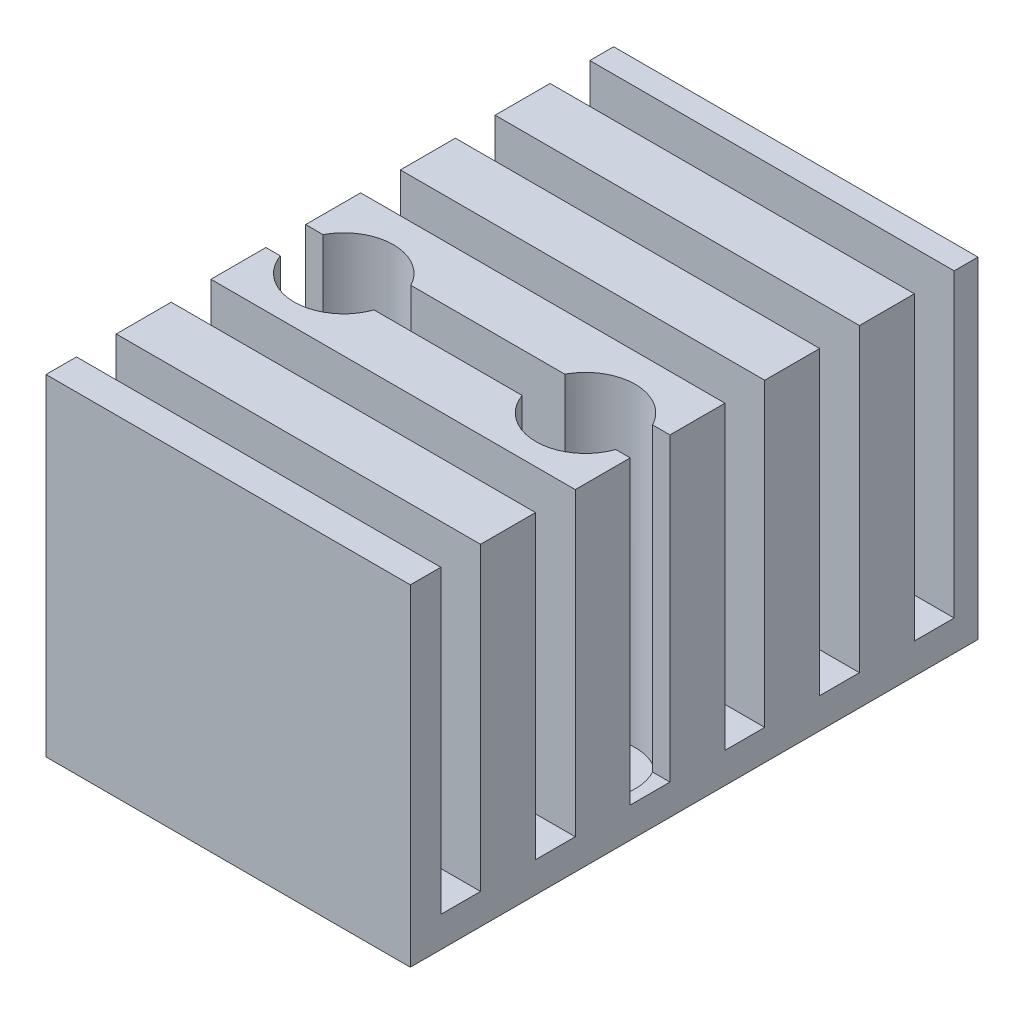
ISO-10303-21;
HEADER;
FILE_DESCRIPTION(('STEP AP214'),'2;1');
FILE_NAME('part.step','',(''),(''),'','','');
FILE_SCHEMA(('AUTOMOTIVE_DESIGN { 1 0 10303 214 1 1 1 1 }'));
ENDSEC;
DATA;
#1=APPLICATION_CONTEXT('core data for automotive mechanical design processes');
#2=APPLICATION_PROTOCOL_DEFINITION('international standard','automotive_design',2000,#1);
#3=PRODUCT_CONTEXT('',#1,'mechanical');
#4=PRODUCT('Part','Part','',(#3));
#5=PRODUCT_RELATED_PRODUCT_CATEGORY('part','',(#4));
#6=PRODUCT_DEFINITION_FORMATION('','',#4);
#7=PRODUCT_DEFINITION_CONTEXT('part definition',#1,'design');
#8=PRODUCT_DEFINITION('design','',#6,#7);
#9=PRODUCT_DEFINITION_SHAPE('','',#8);
#10=(LENGTH_UNIT() NAMED_UNIT(*) SI_UNIT(.MILLI.,.METRE.));
#11=(NAMED_UNIT(*) PLANE_ANGLE_UNIT() SI_UNIT($,.RADIAN.));
#12=(NAMED_UNIT(*) SI_UNIT($,.STERADIAN.) SOLID_ANGLE_UNIT());
#13=UNCERTAINTY_MEASURE_WITH_UNIT(LENGTH_MEASURE(1.E-05),#10,'distance_accuracy_value','');
#14=(GEOMETRIC_REPRESENTATION_CONTEXT(3) GLOBAL_UNCERTAINTY_ASSIGNED_CONTEXT((#13)) GLOBAL_UNIT_ASSIGNED_CONTEXT((#10,
#11,#12)) REPRESENTATION_CONTEXT('',''));
#15=CARTESIAN_POINT('',(0.,0.,0.));
#16=DIRECTION('',(0.,0.,1.));
#17=DIRECTION('',(1.,0.,0.));
#18=AXIS2_PLACEMENT_3D('',#15,#16,#17);
#19=CARTESIAN_POINT('',(3.65,10.,1.43));
#20=DIRECTION('',(0.,-1.,0.));
#21=DIRECTION('',(0.,0.,-1.));
#22=AXIS2_PLACEMENT_3D('',#19,#20,#21);
#23=CYLINDRICAL_SURFACE('',#22,0.799999999999999);
#24=CARTESIAN_POINT('',(3.65,0.,1.43));
#25=DIRECTION('',(0.,1.,0.));
#26=DIRECTION('',(0.,0.,1.));
#27=AXIS2_PLACEMENT_3D('',#24,#25,#26);
#28=CIRCLE('',#27,0.799999999999999);
#29=CARTESIAN_POINT('',(3.65,0.,2.23));
#30=VERTEX_POINT('',#29);
#31=EDGE_CURVE('E613',#30,#30,#28,.T.);
#32=ORIENTED_EDGE('',*,*,#31,.F.);
#33=EDGE_LOOP('',(#32));
#34=FACE_BOUND('',#33,.T.);
#35=CARTESIAN_POINT('',(3.65,0.5,1.43));
#36=DIRECTION('',(0.,1.,0.));
#37=DIRECTION('',(0.,0.,1.));
#38=AXIS2_PLACEMENT_3D('',#35,#36,#37);
#39=CIRCLE('',#38,0.799999999999999);
#40=CARTESIAN_POINT('',(3.65,0.5,2.23));
#41=VERTEX_POINT('',#40);
#42=EDGE_CURVE('E43',#41,#41,#39,.T.);
#43=ORIENTED_EDGE('',*,*,#42,.T.);
#44=EDGE_LOOP('',(#43));
#45=FACE_BOUND('',#44,.T.);
#46=ADVANCED_FACE('F39',(#34,#45),#23,.F.);
#47=CARTESIAN_POINT('',(-3.65,10.,1.43));
#48=DIRECTION('',(0.,-1.,0.));
#49=DIRECTION('',(0.,0.,-1.));
#50=AXIS2_PLACEMENT_3D('',#47,#48,#49);
#51=CYLINDRICAL_SURFACE('',#50,0.8);
#52=CARTESIAN_POINT('',(-3.65,0.,1.43));
#53=DIRECTION('',(0.,1.,0.));
#54=DIRECTION('',(0.,0.,1.));
#55=AXIS2_PLACEMENT_3D('',#52,#53,#54);
#56=CIRCLE('',#55,0.8);
#57=CARTESIAN_POINT('',(-3.65,0.,2.23));
#58=VERTEX_POINT('',#57);
#59=EDGE_CURVE('E553',#58,#58,#56,.T.);
#60=ORIENTED_EDGE('',*,*,#59,.F.);
#61=EDGE_LOOP('',(#60));
#62=FACE_BOUND('',#61,.T.);
#63=CARTESIAN_POINT('',(-3.65,0.5,1.43));
#64=DIRECTION('',(0.,1.,0.));
#65=DIRECTION('',(0.,0.,1.));
#66=AXIS2_PLACEMENT_3D('',#63,#64,#65);
#67=CIRCLE('',#66,0.8);
#68=CARTESIAN_POINT('',(-3.65,0.5,2.23));
#69=VERTEX_POINT('',#68);
#70=EDGE_CURVE('E480',#69,#69,#67,.T.);
#71=ORIENTED_EDGE('',*,*,#70,.T.);
#72=EDGE_LOOP('',(#71));
#73=FACE_BOUND('',#72,.T.);
#74=ADVANCED_FACE('F738',(#62,#73),#51,.F.);
#75=CARTESIAN_POINT('',(0.,10.,0.));
#76=DIRECTION('',(0.,-1.,0.));
#77=DIRECTION('',(0.,0.,-1.));
#78=AXIS2_PLACEMENT_3D('',#75,#76,#77);
#79=PLANE('',#78);
#80=DIRECTION('',(0.,0.,-1.));
#81=VECTOR('',#80,1.);
#82=CARTESIAN_POINT('',(5.5,10.,8.57));
#83=LINE('',#82,#81);
#84=CARTESIAN_POINT('',(5.5,10.,8.57));
#85=VERTEX_POINT('',#84);
#86=CARTESIAN_POINT('',(5.5,10.,7.65));
#87=VERTEX_POINT('',#86);
#88=EDGE_CURVE('E724',#85,#87,#83,.T.);
#89=ORIENTED_EDGE('',*,*,#88,.T.);
#90=DIRECTION('',(1.,0.,0.));
#91=VECTOR('',#90,1.);
#92=CARTESIAN_POINT('',(-5.5,10.,7.65));
#93=LINE('',#92,#91);
#94=CARTESIAN_POINT('',(-5.5,10.,7.65));
#95=VERTEX_POINT('',#94);
#96=EDGE_CURVE('E550',#95,#87,#93,.T.);
#97=ORIENTED_EDGE('',*,*,#96,.F.);
#98=DIRECTION('',(0.,0.,1.));
#99=VECTOR('',#98,1.);
#100=CARTESIAN_POINT('',(-5.5,10.,8.57));
#101=LINE('',#100,#99);
#102=CARTESIAN_POINT('',(-5.5,10.,8.57));
#103=VERTEX_POINT('',#102);
#104=EDGE_CURVE('E595',#95,#103,#101,.T.);
#105=ORIENTED_EDGE('',*,*,#104,.T.);
#106=DIRECTION('',(1.,0.,0.));
#107=VECTOR('',#106,1.);
#108=CARTESIAN_POINT('',(-5.5,10.,8.57));
#109=LINE('',#108,#107);
#110=EDGE_CURVE('E601',#103,#85,#109,.T.);
#111=ORIENTED_EDGE('',*,*,#110,.T.);
#112=EDGE_LOOP('',(#89,#97,#105,#111));
#113=FACE_BOUND('',#112,.T.);
#114=ADVANCED_FACE('F741',(#113),#79,.F.);
#115=DIRECTION('',(1.,0.,0.));
#116=VECTOR('',#115,1.);
#117=CARTESIAN_POINT('',(-5.5,10.,1.93));
#118=LINE('',#117,#116);
#119=CARTESIAN_POINT('',(-2.23578643762691,10.,1.93));
#120=VERTEX_POINT('',#119);
#121=CARTESIAN_POINT('',(2.23578643762691,10.,1.93));
#122=VERTEX_POINT('',#121);
#123=EDGE_CURVE('E648',#120,#122,#118,.T.);
#124=ORIENTED_EDGE('',*,*,#123,.F.);
#125=CARTESIAN_POINT('',(-3.65,10.,1.43));
#126=DIRECTION('',(0.,1.,0.));
#127=DIRECTION('',(0.,0.,1.));
#128=AXIS2_PLACEMENT_3D('',#125,#126,#127);
#129=CIRCLE('',#128,1.5);
#130=CARTESIAN_POINT('',(-5.0642135623731,10.,1.93));
#131=VERTEX_POINT('',#130);
#132=EDGE_CURVE('E520',#131,#120,#129,.T.);
#133=ORIENTED_EDGE('',*,*,#132,.F.);
#134=CARTESIAN_POINT('',(-5.5,10.,1.93));
#135=VERTEX_POINT('',#134);
#136=EDGE_CURVE('E586',#135,#131,#118,.T.);
#137=ORIENTED_EDGE('',*,*,#136,.F.);
#138=CARTESIAN_POINT('',(-5.5,10.,3.59));
#139=VERTEX_POINT('',#138);
#140=EDGE_CURVE('E576',#135,#139,#101,.T.);
#141=ORIENTED_EDGE('',*,*,#140,.T.);
#142=DIRECTION('',(1.,0.,0.));
#143=VECTOR('',#142,1.);
#144=CARTESIAN_POINT('',(-5.5,10.,3.59));
#145=LINE('',#144,#143);
#146=CARTESIAN_POINT('',(5.5,10.,3.59));
#147=VERTEX_POINT('',#146);
#148=EDGE_CURVE('E334',#139,#147,#145,.T.);
#149=ORIENTED_EDGE('',*,*,#148,.T.);
#150=CARTESIAN_POINT('',(5.5,10.,1.93));
#151=VERTEX_POINT('',#150);
#152=EDGE_CURVE('E646',#147,#151,#83,.T.);
#153=ORIENTED_EDGE('',*,*,#152,.T.);
#154=CARTESIAN_POINT('',(5.0642135623731,10.,1.93));
#155=VERTEX_POINT('',#154);
#156=EDGE_CURVE('E360',#155,#151,#118,.T.);
#157=ORIENTED_EDGE('',*,*,#156,.F.);
#158=CARTESIAN_POINT('',(3.65,10.,1.43));
#159=DIRECTION('',(0.,1.,0.));
#160=DIRECTION('',(0.,0.,1.));
#161=AXIS2_PLACEMENT_3D('',#158,#159,#160);
#162=CIRCLE('',#161,1.5);
#163=EDGE_CURVE('E64',#122,#155,#162,.T.);
#164=ORIENTED_EDGE('',*,*,#163,.F.);
#165=EDGE_LOOP('',(#124,#133,#137,#141,#149,#153,#157,#164));
#166=FACE_BOUND('',#165,.T.);
#167=ADVANCED_FACE('F581',(#166),#79,.F.);
#168=DIRECTION('',(1.,0.,0.));
#169=VECTOR('',#168,1.);
#170=CARTESIAN_POINT('',(-5.5,10.,0.73));
#171=LINE('',#170,#169);
#172=CARTESIAN_POINT('',(-5.5,10.,0.73));
#173=VERTEX_POINT('',#172);
#174=CARTESIAN_POINT('',(-4.97664991614216,10.,0.73));
#175=VERTEX_POINT('',#174);
#176=EDGE_CURVE('E304',#173,#175,#171,.T.);
#177=ORIENTED_EDGE('',*,*,#176,.T.);
#178=CARTESIAN_POINT('',(-2.32335008385784,10.,0.73));
#179=VERTEX_POINT('',#178);
#180=EDGE_CURVE('E57',#179,#175,#129,.T.);
#181=ORIENTED_EDGE('',*,*,#180,.F.);
#182=CARTESIAN_POINT('',(2.32335008385784,10.,0.73));
#183=VERTEX_POINT('',#182);
#184=EDGE_CURVE('E293',#179,#183,#171,.T.);
#185=ORIENTED_EDGE('',*,*,#184,.T.);
#186=CARTESIAN_POINT('',(4.97664991614216,10.,0.73));
#187=VERTEX_POINT('',#186);
#188=EDGE_CURVE('E275',#187,#183,#162,.T.);
#189=ORIENTED_EDGE('',*,*,#188,.F.);
#190=CARTESIAN_POINT('',(5.5,10.,0.73));
#191=VERTEX_POINT('',#190);
#192=EDGE_CURVE('E290',#187,#191,#171,.T.);
#193=ORIENTED_EDGE('',*,*,#192,.T.);
#194=CARTESIAN_POINT('',(5.5,10.,-0.93));
#195=VERTEX_POINT('',#194);
#196=EDGE_CURVE('E682',#191,#195,#83,.T.);
#197=ORIENTED_EDGE('',*,*,#196,.T.);
#198=DIRECTION('',(1.,0.,0.));
#199=VECTOR('',#198,1.);
#200=CARTESIAN_POINT('',(-5.5,10.,-0.93));
#201=LINE('',#200,#199);
#202=CARTESIAN_POINT('',(-5.5,10.,-0.93));
#203=VERTEX_POINT('',#202);
#204=EDGE_CURVE('E379',#203,#195,#201,.T.);
#205=ORIENTED_EDGE('',*,*,#204,.F.);
#206=EDGE_CURVE('E588',#203,#173,#101,.T.);
#207=ORIENTED_EDGE('',*,*,#206,.T.);
#208=EDGE_LOOP('',(#177,#181,#185,#189,#193,#197,#205,#207));
#209=FACE_BOUND('',#208,.T.);
#210=ADVANCED_FACE('F288',(#209),#79,.F.);
#211=CARTESIAN_POINT('',(-5.5,10.,-3.79));
#212=VERTEX_POINT('',#211);
#213=CARTESIAN_POINT('',(-5.5,10.,-2.13));
#214=VERTEX_POINT('',#213);
#215=EDGE_CURVE('E593',#212,#214,#101,.T.);
#216=ORIENTED_EDGE('',*,*,#215,.T.);
#217=DIRECTION('',(1.,0.,0.));
#218=VECTOR('',#217,1.);
#219=CARTESIAN_POINT('',(-5.5,10.,-2.13));
#220=LINE('',#219,#218);
#221=CARTESIAN_POINT('',(5.5,10.,-2.13));
#222=VERTEX_POINT('',#221);
#223=EDGE_CURVE('E366',#214,#222,#220,.T.);
#224=ORIENTED_EDGE('',*,*,#223,.T.);
#225=CARTESIAN_POINT('',(5.5,10.,-3.79));
#226=VERTEX_POINT('',#225);
#227=EDGE_CURVE('E721',#222,#226,#83,.T.);
#228=ORIENTED_EDGE('',*,*,#227,.T.);
#229=DIRECTION('',(1.,0.,0.));
#230=VECTOR('',#229,1.);
#231=CARTESIAN_POINT('',(-5.5,10.,-3.79));
#232=LINE('',#231,#230);
#233=EDGE_CURVE('E415',#212,#226,#232,.T.);
#234=ORIENTED_EDGE('',*,*,#233,.F.);
#235=EDGE_LOOP('',(#216,#224,#228,#234));
#236=FACE_BOUND('',#235,.T.);
#237=ADVANCED_FACE('F700',(#236),#79,.F.);
#238=CARTESIAN_POINT('',(-5.5,10.,-6.65));
#239=VERTEX_POINT('',#238);
#240=CARTESIAN_POINT('',(-5.5,10.,-4.99));
#241=VERTEX_POINT('',#240);
#242=EDGE_CURVE('E602',#239,#241,#101,.T.);
#243=ORIENTED_EDGE('',*,*,#242,.T.);
#244=DIRECTION('',(1.,0.,0.));
#245=VECTOR('',#244,1.);
#246=CARTESIAN_POINT('',(-5.5,10.,-4.99));
#247=LINE('',#246,#245);
#248=CARTESIAN_POINT('',(5.5,10.,-4.99));
#249=VERTEX_POINT('',#248);
#250=EDGE_CURVE('E405',#241,#249,#247,.T.);
#251=ORIENTED_EDGE('',*,*,#250,.T.);
#252=CARTESIAN_POINT('',(5.5,10.,-6.65));
#253=VERTEX_POINT('',#252);
#254=EDGE_CURVE('E718',#249,#253,#83,.T.);
#255=ORIENTED_EDGE('',*,*,#254,.T.);
#256=DIRECTION('',(1.,0.,0.));
#257=VECTOR('',#256,1.);
#258=CARTESIAN_POINT('',(-5.5,10.,-6.65));
#259=LINE('',#258,#257);
#260=EDGE_CURVE('E451',#239,#253,#259,.T.);
#261=ORIENTED_EDGE('',*,*,#260,.F.);
#262=EDGE_LOOP('',(#243,#251,#255,#261));
#263=FACE_BOUND('',#262,.T.);
#264=ADVANCED_FACE('F708',(#263),#79,.F.);
#265=CARTESIAN_POINT('',(-5.5,10.,-8.57));
#266=VERTEX_POINT('',#265);
#267=CARTESIAN_POINT('',(-5.5,10.,-7.85));
#268=VERTEX_POINT('',#267);
#269=EDGE_CURVE('E596',#266,#268,#101,.T.);
#270=ORIENTED_EDGE('',*,*,#269,.T.);
#271=DIRECTION('',(1.,0.,0.));
#272=VECTOR('',#271,1.);
#273=CARTESIAN_POINT('',(-5.5,10.,-7.85));
#274=LINE('',#273,#272);
#275=CARTESIAN_POINT('',(5.5,10.,-7.85));
#276=VERTEX_POINT('',#275);
#277=EDGE_CURVE('E441',#268,#276,#274,.T.);
#278=ORIENTED_EDGE('',*,*,#277,.T.);
#279=CARTESIAN_POINT('',(5.5,10.,-8.57));
#280=VERTEX_POINT('',#279);
#281=EDGE_CURVE('E622',#276,#280,#83,.T.);
#282=ORIENTED_EDGE('',*,*,#281,.T.);
#283=DIRECTION('',(-1.,0.,0.));
#284=VECTOR('',#283,1.);
#285=CARTESIAN_POINT('',(-5.5,10.,-8.57));
#286=LINE('',#285,#284);
#287=EDGE_CURVE('E603',#280,#266,#286,.T.);
#288=ORIENTED_EDGE('',*,*,#287,.T.);
#289=EDGE_LOOP('',(#270,#278,#282,#288));
#290=FACE_BOUND('',#289,.T.);
#291=ADVANCED_FACE('F771',(#290),#79,.F.);
#292=CARTESIAN_POINT('',(-5.5,10.,4.79));
#293=VERTEX_POINT('',#292);
#294=CARTESIAN_POINT('',(-5.5,10.,6.45));
#295=VERTEX_POINT('',#294);
#296=EDGE_CURVE('E589',#293,#295,#101,.T.);
#297=ORIENTED_EDGE('',*,*,#296,.T.);
#298=DIRECTION('',(1.,0.,0.));
#299=VECTOR('',#298,1.);
#300=CARTESIAN_POINT('',(-5.5,10.,6.45));
#301=LINE('',#300,#299);
#302=CARTESIAN_POINT('',(5.5,10.,6.45));
#303=VERTEX_POINT('',#302);
#304=EDGE_CURVE('E554',#295,#303,#301,.T.);
#305=ORIENTED_EDGE('',*,*,#304,.T.);
#306=CARTESIAN_POINT('',(5.5,10.,4.79));
#307=VERTEX_POINT('',#306);
#308=EDGE_CURVE('E728',#303,#307,#83,.T.);
#309=ORIENTED_EDGE('',*,*,#308,.T.);
#310=DIRECTION('',(1.,0.,0.));
#311=VECTOR('',#310,1.);
#312=CARTESIAN_POINT('',(-5.5,10.,4.79));
#313=LINE('',#312,#311);
#314=EDGE_CURVE('E345',#293,#307,#313,.T.);
#315=ORIENTED_EDGE('',*,*,#314,.F.);
#316=EDGE_LOOP('',(#297,#305,#309,#315));
#317=FACE_BOUND('',#316,.T.);
#318=ADVANCED_FACE('F768',(#317),#79,.F.);
#319=CARTESIAN_POINT('',(0.,0.,0.));
#320=DIRECTION('',(0.,-1.,0.));
#321=DIRECTION('',(0.,0.,-1.));
#322=AXIS2_PLACEMENT_3D('',#319,#320,#321);
#323=PLANE('',#322);
#324=ORIENTED_EDGE('',*,*,#31,.T.);
#325=EDGE_LOOP('',(#324));
#326=FACE_BOUND('',#325,.T.);
#327=DIRECTION('',(0.,0.,-1.));
#328=VECTOR('',#327,1.);
#329=CARTESIAN_POINT('',(5.5,0.,8.57));
#330=LINE('',#329,#328);
#331=CARTESIAN_POINT('',(5.5,0.,8.57));
#332=VERTEX_POINT('',#331);
#333=CARTESIAN_POINT('',(5.5,0.,-8.57));
#334=VERTEX_POINT('',#333);
#335=EDGE_CURVE('E608',#332,#334,#330,.T.);
#336=ORIENTED_EDGE('',*,*,#335,.F.);
#337=DIRECTION('',(1.,0.,0.));
#338=VECTOR('',#337,1.);
#339=CARTESIAN_POINT('',(-5.5,0.,8.57));
#340=LINE('',#339,#338);
#341=CARTESIAN_POINT('',(-5.5,0.,8.57));
#342=VERTEX_POINT('',#341);
#343=EDGE_CURVE('E619',#342,#332,#340,.T.);
#344=ORIENTED_EDGE('',*,*,#343,.F.);
#345=DIRECTION('',(0.,0.,1.));
#346=VECTOR('',#345,1.);
#347=CARTESIAN_POINT('',(-5.5,0.,8.57));
#348=LINE('',#347,#346);
#349=CARTESIAN_POINT('',(-5.5,0.,-8.57));
#350=VERTEX_POINT('',#349);
#351=EDGE_CURVE('E616',#350,#342,#348,.T.);
#352=ORIENTED_EDGE('',*,*,#351,.F.);
#353=DIRECTION('',(-1.,0.,0.));
#354=VECTOR('',#353,1.);
#355=CARTESIAN_POINT('',(-5.5,0.,-8.57));
#356=LINE('',#355,#354);
#357=EDGE_CURVE('E612',#334,#350,#356,.T.);
#358=ORIENTED_EDGE('',*,*,#357,.F.);
#359=EDGE_LOOP('',(#336,#344,#352,#358));
#360=FACE_BOUND('',#359,.T.);
#361=ORIENTED_EDGE('',*,*,#59,.T.);
#362=EDGE_LOOP('',(#361));
#363=FACE_BOUND('',#362,.T.);
#364=ADVANCED_FACE('F736',(#326,#360,#363),#323,.T.);
#365=CARTESIAN_POINT('',(5.5,10.,8.57));
#366=DIRECTION('',(-1.,0.,0.));
#367=DIRECTION('',(0.,0.,1.));
#368=AXIS2_PLACEMENT_3D('',#365,#366,#367);
#369=PLANE('',#368);
#370=DIRECTION('',(0.,0.,-1.));
#371=VECTOR('',#370,1.);
#372=CARTESIAN_POINT('',(5.5,0.92224491566828,7.65));
#373=LINE('',#372,#371);
#374=CARTESIAN_POINT('',(5.5,0.92224491566828,7.65));
#375=VERTEX_POINT('',#374);
#376=CARTESIAN_POINT('',(5.5,0.92224491566828,6.45));
#377=VERTEX_POINT('',#376);
#378=EDGE_CURVE('E544',#375,#377,#373,.T.);
#379=ORIENTED_EDGE('',*,*,#378,.F.);
#380=DIRECTION('',(0.,-1.,0.));
#381=VECTOR('',#380,1.);
#382=CARTESIAN_POINT('',(5.5,10.,7.65));
#383=LINE('',#382,#381);
#384=EDGE_CURVE('E338',#87,#375,#383,.T.);
#385=ORIENTED_EDGE('',*,*,#384,.F.);
#386=ORIENTED_EDGE('',*,*,#88,.F.);
#387=DIRECTION('',(0.,-1.,0.));
#388=VECTOR('',#387,1.);
#389=CARTESIAN_POINT('',(5.5,10.,8.57));
#390=LINE('',#389,#388);
#391=EDGE_CURVE('E607',#85,#332,#390,.T.);
#392=ORIENTED_EDGE('',*,*,#391,.T.);
#393=ORIENTED_EDGE('',*,*,#335,.T.);
#394=DIRECTION('',(0.,-1.,0.));
#395=VECTOR('',#394,1.);
#396=CARTESIAN_POINT('',(5.5,10.,-8.57));
#397=LINE('',#396,#395);
#398=EDGE_CURVE('E634',#280,#334,#397,.T.);
#399=ORIENTED_EDGE('',*,*,#398,.F.);
#400=ORIENTED_EDGE('',*,*,#281,.F.);
#401=DIRECTION('',(0.,1.,0.));
#402=VECTOR('',#401,1.);
#403=CARTESIAN_POINT('',(5.5,10.,-7.85));
#404=LINE('',#403,#402);
#405=CARTESIAN_POINT('',(5.5,0.92224491566828,-7.85));
#406=VERTEX_POINT('',#405);
#407=EDGE_CURVE('E466',#406,#276,#404,.T.);
#408=ORIENTED_EDGE('',*,*,#407,.F.);
#409=DIRECTION('',(0.,0.,-1.));
#410=VECTOR('',#409,1.);
#411=CARTESIAN_POINT('',(5.5,0.92224491566828,-6.65));
#412=LINE('',#411,#410);
#413=CARTESIAN_POINT('',(5.5,0.92224491566828,-6.65));
#414=VERTEX_POINT('',#413);
#415=EDGE_CURVE('E469',#414,#406,#412,.T.);
#416=ORIENTED_EDGE('',*,*,#415,.F.);
#417=DIRECTION('',(0.,-1.,0.));
#418=VECTOR('',#417,1.);
#419=CARTESIAN_POINT('',(5.5,10.,-6.65));
#420=LINE('',#419,#418);
#421=EDGE_CURVE('E473',#253,#414,#420,.T.);
#422=ORIENTED_EDGE('',*,*,#421,.F.);
#423=ORIENTED_EDGE('',*,*,#254,.F.);
#424=DIRECTION('',(0.,1.,0.));
#425=VECTOR('',#424,1.);
#426=CARTESIAN_POINT('',(5.5,10.,-4.99));
#427=LINE('',#426,#425);
#428=CARTESIAN_POINT('',(5.5,0.92224491566828,-4.99));
#429=VERTEX_POINT('',#428);
#430=EDGE_CURVE('E430',#429,#249,#427,.T.);
#431=ORIENTED_EDGE('',*,*,#430,.F.);
#432=DIRECTION('',(0.,0.,-1.));
#433=VECTOR('',#432,1.);
#434=CARTESIAN_POINT('',(5.5,0.92224491566828,-3.79));
#435=LINE('',#434,#433);
#436=CARTESIAN_POINT('',(5.5,0.92224491566828,-3.79));
#437=VERTEX_POINT('',#436);
#438=EDGE_CURVE('E433',#437,#429,#435,.T.);
#439=ORIENTED_EDGE('',*,*,#438,.F.);
#440=DIRECTION('',(0.,-1.,0.));
#441=VECTOR('',#440,1.);
#442=CARTESIAN_POINT('',(5.5,10.,-3.79));
#443=LINE('',#442,#441);
#444=EDGE_CURVE('E437',#226,#437,#443,.T.);
#445=ORIENTED_EDGE('',*,*,#444,.F.);
#446=ORIENTED_EDGE('',*,*,#227,.F.);
#447=DIRECTION('',(0.,1.,0.));
#448=VECTOR('',#447,1.);
#449=CARTESIAN_POINT('',(5.5,10.,-2.13));
#450=LINE('',#449,#448);
#451=CARTESIAN_POINT('',(5.5,0.92224491566828,-2.13));
#452=VERTEX_POINT('',#451);
#453=EDGE_CURVE('E394',#452,#222,#450,.T.);
#454=ORIENTED_EDGE('',*,*,#453,.F.);
#455=DIRECTION('',(0.,0.,-1.));
#456=VECTOR('',#455,1.);
#457=CARTESIAN_POINT('',(5.5,0.92224491566828,-0.930000000000001));
#458=LINE('',#457,#456);
#459=CARTESIAN_POINT('',(5.5,0.92224491566828,-0.930000000000001));
#460=VERTEX_POINT('',#459);
#461=EDGE_CURVE('E397',#460,#452,#458,.T.);
#462=ORIENTED_EDGE('',*,*,#461,.F.);
#463=DIRECTION('',(0.,-1.,0.));
#464=VECTOR('',#463,1.);
#465=CARTESIAN_POINT('',(5.5,10.,-0.93));
#466=LINE('',#465,#464);
#467=EDGE_CURVE('E401',#195,#460,#466,.T.);
#468=ORIENTED_EDGE('',*,*,#467,.F.);
#469=ORIENTED_EDGE('',*,*,#196,.F.);
#470=DIRECTION('',(0.,1.,0.));
#471=VECTOR('',#470,1.);
#472=CARTESIAN_POINT('',(5.5,10.,0.73));
#473=LINE('',#472,#471);
#474=CARTESIAN_POINT('',(5.5,0.92224491566828,0.729999999999999));
#475=VERTEX_POINT('',#474);
#476=EDGE_CURVE('E299',#475,#191,#473,.T.);
#477=ORIENTED_EDGE('',*,*,#476,.F.);
#478=DIRECTION('',(0.,0.,-1.));
#479=VECTOR('',#478,1.);
#480=CARTESIAN_POINT('',(5.5,0.92224491566828,1.93));
#481=LINE('',#480,#479);
#482=CARTESIAN_POINT('',(5.5,0.92224491566828,1.93));
#483=VERTEX_POINT('',#482);
#484=EDGE_CURVE('E365',#483,#475,#481,.T.);
#485=ORIENTED_EDGE('',*,*,#484,.F.);
#486=DIRECTION('',(0.,-1.,0.));
#487=VECTOR('',#486,1.);
#488=CARTESIAN_POINT('',(5.5,10.,1.93));
#489=LINE('',#488,#487);
#490=EDGE_CURVE('E361',#151,#483,#489,.T.);
#491=ORIENTED_EDGE('',*,*,#490,.F.);
#492=ORIENTED_EDGE('',*,*,#152,.F.);
#493=DIRECTION('',(0.,1.,0.));
#494=VECTOR('',#493,1.);
#495=CARTESIAN_POINT('',(5.5,10.,3.59));
#496=LINE('',#495,#494);
#497=CARTESIAN_POINT('',(5.5,0.92224491566828,3.59));
#498=VERTEX_POINT('',#497);
#499=EDGE_CURVE('E325',#498,#147,#496,.T.);
#500=ORIENTED_EDGE('',*,*,#499,.F.);
#501=DIRECTION('',(0.,0.,-1.));
#502=VECTOR('',#501,1.);
#503=CARTESIAN_POINT('',(5.5,0.92224491566828,4.79));
#504=LINE('',#503,#502);
#505=CARTESIAN_POINT('',(5.5,0.92224491566828,4.79));
#506=VERTEX_POINT('',#505);
#507=EDGE_CURVE('E317',#506,#498,#504,.T.);
#508=ORIENTED_EDGE('',*,*,#507,.F.);
#509=DIRECTION('',(0.,-1.,0.));
#510=VECTOR('',#509,1.);
#511=CARTESIAN_POINT('',(5.5,10.,4.79));
#512=LINE('',#511,#510);
#513=EDGE_CURVE('E313',#307,#506,#512,.T.);
#514=ORIENTED_EDGE('',*,*,#513,.F.);
#515=ORIENTED_EDGE('',*,*,#308,.F.);
#516=DIRECTION('',(0.,1.,0.));
#517=VECTOR('',#516,1.);
#518=CARTESIAN_POINT('',(5.5,10.,6.45));
#519=LINE('',#518,#517);
#520=EDGE_CURVE('E532',#377,#303,#519,.T.);
#521=ORIENTED_EDGE('',*,*,#520,.F.);
#522=EDGE_LOOP('',(#379,#385,#386,#392,#393,#399,#400,#408,#416,#422,#423,#431,#439,#445,#446,
#454,#462,#468,#469,#477,#485,#491,#492,#500,#508,#514,#515,#521));
#523=FACE_BOUND('',#522,.T.);
#524=ADVANCED_FACE('F41',(#523),#369,.F.);
#525=CARTESIAN_POINT('',(-5.5,10.,-8.57));
#526=DIRECTION('',(0.,0.,1.));
#527=DIRECTION('',(1.,0.,0.));
#528=AXIS2_PLACEMENT_3D('',#525,#526,#527);
#529=PLANE('',#528);
#530=ORIENTED_EDGE('',*,*,#357,.T.);
#531=DIRECTION('',(0.,-1.,0.));
#532=VECTOR('',#531,1.);
#533=CARTESIAN_POINT('',(-5.5,10.,-8.57));
#534=LINE('',#533,#532);
#535=EDGE_CURVE('E630',#266,#350,#534,.T.);
#536=ORIENTED_EDGE('',*,*,#535,.F.);
#537=ORIENTED_EDGE('',*,*,#287,.F.);
#538=ORIENTED_EDGE('',*,*,#398,.T.);
#539=EDGE_LOOP('',(#530,#536,#537,#538));
#540=FACE_BOUND('',#539,.T.);
#541=ADVANCED_FACE('F781',(#540),#529,.F.);
#542=CARTESIAN_POINT('',(-5.5,10.,8.57));
#543=DIRECTION('',(1.,0.,0.));
#544=DIRECTION('',(0.,0.,-1.));
#545=AXIS2_PLACEMENT_3D('',#542,#543,#544);
#546=PLANE('',#545);
#547=ORIENTED_EDGE('',*,*,#104,.F.);
#548=DIRECTION('',(0.,-1.,0.));
#549=VECTOR('',#548,1.);
#550=CARTESIAN_POINT('',(-5.5,10.,7.65));
#551=LINE('',#550,#549);
#552=CARTESIAN_POINT('',(-5.5,0.92224491566828,7.65));
#553=VERTEX_POINT('',#552);
#554=EDGE_CURVE('E527',#95,#553,#551,.T.);
#555=ORIENTED_EDGE('',*,*,#554,.T.);
#556=DIRECTION('',(0.,0.,-1.));
#557=VECTOR('',#556,1.);
#558=CARTESIAN_POINT('',(-5.5,0.92224491566828,7.65));
#559=LINE('',#558,#557);
#560=CARTESIAN_POINT('',(-5.5,0.92224491566828,6.45));
#561=VERTEX_POINT('',#560);
#562=EDGE_CURVE('E531',#553,#561,#559,.T.);
#563=ORIENTED_EDGE('',*,*,#562,.T.);
#564=DIRECTION('',(0.,1.,0.));
#565=VECTOR('',#564,1.);
#566=CARTESIAN_POINT('',(-5.5,10.,6.45));
#567=LINE('',#566,#565);
#568=EDGE_CURVE('E536',#561,#295,#567,.T.);
#569=ORIENTED_EDGE('',*,*,#568,.T.);
#570=ORIENTED_EDGE('',*,*,#296,.F.);
#571=DIRECTION('',(0.,-1.,0.));
#572=VECTOR('',#571,1.);
#573=CARTESIAN_POINT('',(-5.5,10.,4.79));
#574=LINE('',#573,#572);
#575=CARTESIAN_POINT('',(-5.5,0.92224491566828,4.79));
#576=VERTEX_POINT('',#575);
#577=EDGE_CURVE('E333',#293,#576,#574,.T.);
#578=ORIENTED_EDGE('',*,*,#577,.T.);
#579=DIRECTION('',(0.,0.,-1.));
#580=VECTOR('',#579,1.);
#581=CARTESIAN_POINT('',(-5.5,0.92224491566828,4.79));
#582=LINE('',#581,#580);
#583=CARTESIAN_POINT('',(-5.5,0.92224491566828,3.59));
#584=VERTEX_POINT('',#583);
#585=EDGE_CURVE('E565',#576,#584,#582,.T.);
#586=ORIENTED_EDGE('',*,*,#585,.T.);
#587=DIRECTION('',(0.,1.,0.));
#588=VECTOR('',#587,1.);
#589=CARTESIAN_POINT('',(-5.5,10.,3.59));
#590=LINE('',#589,#588);
#591=EDGE_CURVE('E328',#584,#139,#590,.T.);
#592=ORIENTED_EDGE('',*,*,#591,.T.);
#593=ORIENTED_EDGE('',*,*,#140,.F.);
#594=DIRECTION('',(0.,-1.,0.));
#595=VECTOR('',#594,1.);
#596=CARTESIAN_POINT('',(-5.5,10.,1.93));
#597=LINE('',#596,#595);
#598=CARTESIAN_POINT('',(-5.5,0.92224491566828,1.93));
#599=VERTEX_POINT('',#598);
#600=EDGE_CURVE('E348',#135,#599,#597,.T.);
#601=ORIENTED_EDGE('',*,*,#600,.T.);
#602=DIRECTION('',(0.,0.,-1.));
#603=VECTOR('',#602,1.);
#604=CARTESIAN_POINT('',(-5.5,0.92224491566828,1.93));
#605=LINE('',#604,#603);
#606=CARTESIAN_POINT('',(-5.5,0.92224491566828,0.729999999999999));
#607=VERTEX_POINT('',#606);
#608=EDGE_CURVE('E352',#599,#607,#605,.T.);
#609=ORIENTED_EDGE('',*,*,#608,.T.);
#610=DIRECTION('',(0.,1.,0.));
#611=VECTOR('',#610,1.);
#612=CARTESIAN_POINT('',(-5.5,10.,0.73));
#613=LINE('',#612,#611);
#614=EDGE_CURVE('E356',#607,#173,#613,.T.);
#615=ORIENTED_EDGE('',*,*,#614,.T.);
#616=ORIENTED_EDGE('',*,*,#206,.F.);
#617=DIRECTION('',(0.,-1.,0.));
#618=VECTOR('',#617,1.);
#619=CARTESIAN_POINT('',(-5.5,10.,-0.93));
#620=LINE('',#619,#618);
#621=CARTESIAN_POINT('',(-5.5,0.92224491566828,-0.930000000000001));
#622=VERTEX_POINT('',#621);
#623=EDGE_CURVE('E390',#203,#622,#620,.T.);
#624=ORIENTED_EDGE('',*,*,#623,.T.);
#625=DIRECTION('',(0.,0.,-1.));
#626=VECTOR('',#625,1.);
#627=CARTESIAN_POINT('',(-5.5,0.92224491566828,-0.930000000000001));
#628=LINE('',#627,#626);
#629=CARTESIAN_POINT('',(-5.5,0.92224491566828,-2.13));
#630=VERTEX_POINT('',#629);
#631=EDGE_CURVE('E386',#622,#630,#628,.T.);
#632=ORIENTED_EDGE('',*,*,#631,.T.);
#633=DIRECTION('',(0.,1.,0.));
#634=VECTOR('',#633,1.);
#635=CARTESIAN_POINT('',(-5.5,10.,-2.13));
#636=LINE('',#635,#634);
#637=EDGE_CURVE('E382',#630,#214,#636,.T.);
#638=ORIENTED_EDGE('',*,*,#637,.T.);
#639=ORIENTED_EDGE('',*,*,#215,.F.);
#640=DIRECTION('',(0.,-1.,0.));
#641=VECTOR('',#640,1.);
#642=CARTESIAN_POINT('',(-5.5,10.,-3.79));
#643=LINE('',#642,#641);
#644=CARTESIAN_POINT('',(-5.5,0.92224491566828,-3.79));
#645=VERTEX_POINT('',#644);
#646=EDGE_CURVE('E426',#212,#645,#643,.T.);
#647=ORIENTED_EDGE('',*,*,#646,.T.);
#648=DIRECTION('',(0.,0.,-1.));
#649=VECTOR('',#648,1.);
#650=CARTESIAN_POINT('',(-5.5,0.92224491566828,-3.79));
#651=LINE('',#650,#649);
#652=CARTESIAN_POINT('',(-5.5,0.92224491566828,-4.99));
#653=VERTEX_POINT('',#652);
#654=EDGE_CURVE('E422',#645,#653,#651,.T.);
#655=ORIENTED_EDGE('',*,*,#654,.T.);
#656=DIRECTION('',(0.,1.,0.));
#657=VECTOR('',#656,1.);
#658=CARTESIAN_POINT('',(-5.5,10.,-4.99));
#659=LINE('',#658,#657);
#660=EDGE_CURVE('E418',#653,#241,#659,.T.);
#661=ORIENTED_EDGE('',*,*,#660,.T.);
#662=ORIENTED_EDGE('',*,*,#242,.F.);
#663=DIRECTION('',(0.,-1.,0.));
#664=VECTOR('',#663,1.);
#665=CARTESIAN_POINT('',(-5.5,10.,-6.65));
#666=LINE('',#665,#664);
#667=CARTESIAN_POINT('',(-5.5,0.92224491566828,-6.65));
#668=VERTEX_POINT('',#667);
#669=EDGE_CURVE('E462',#239,#668,#666,.T.);
#670=ORIENTED_EDGE('',*,*,#669,.T.);
#671=DIRECTION('',(0.,0.,-1.));
#672=VECTOR('',#671,1.);
#673=CARTESIAN_POINT('',(-5.5,0.92224491566828,-6.65));
#674=LINE('',#673,#672);
#675=CARTESIAN_POINT('',(-5.5,0.92224491566828,-7.85));
#676=VERTEX_POINT('',#675);
#677=EDGE_CURVE('E458',#668,#676,#674,.T.);
#678=ORIENTED_EDGE('',*,*,#677,.T.);
#679=DIRECTION('',(0.,1.,0.));
#680=VECTOR('',#679,1.);
#681=CARTESIAN_POINT('',(-5.5,10.,-7.85));
#682=LINE('',#681,#680);
#683=EDGE_CURVE('E454',#676,#268,#682,.T.);
#684=ORIENTED_EDGE('',*,*,#683,.T.);
#685=ORIENTED_EDGE('',*,*,#269,.F.);
#686=ORIENTED_EDGE('',*,*,#535,.T.);
#687=ORIENTED_EDGE('',*,*,#351,.T.);
#688=DIRECTION('',(0.,-1.,0.));
#689=VECTOR('',#688,1.);
#690=CARTESIAN_POINT('',(-5.5,10.,8.57));
#691=LINE('',#690,#689);
#692=EDGE_CURVE('E626',#103,#342,#691,.T.);
#693=ORIENTED_EDGE('',*,*,#692,.F.);
#694=EDGE_LOOP('',(#547,#555,#563,#569,#570,#578,#586,#592,#593,#601,#609,#615,#616,#624,#632,
#638,#639,#647,#655,#661,#662,#670,#678,#684,#685,#686,#687,#693));
#695=FACE_BOUND('',#694,.T.);
#696=ADVANCED_FACE('F575',(#695),#546,.F.);
#697=CARTESIAN_POINT('',(-5.5,10.,8.57));
#698=DIRECTION('',(0.,0.,-1.));
#699=DIRECTION('',(-1.,0.,0.));
#700=AXIS2_PLACEMENT_3D('',#697,#698,#699);
#701=PLANE('',#700);
#702=ORIENTED_EDGE('',*,*,#343,.T.);
#703=ORIENTED_EDGE('',*,*,#391,.F.);
#704=ORIENTED_EDGE('',*,*,#110,.F.);
#705=ORIENTED_EDGE('',*,*,#692,.T.);
#706=EDGE_LOOP('',(#702,#703,#704,#705));
#707=FACE_BOUND('',#706,.T.);
#708=ADVANCED_FACE('F776',(#707),#701,.F.);
#709=CARTESIAN_POINT('',(-5.5,10.,1.93));
#710=DIRECTION('',(0.,0.,1.));
#711=DIRECTION('',(0.,-1.,0.));
#712=AXIS2_PLACEMENT_3D('',#709,#710,#711);
#713=PLANE('',#712);
#714=DIRECTION('',(1.,0.,0.));
#715=VECTOR('',#714,1.);
#716=CARTESIAN_POINT('',(-5.5,0.92224491566828,1.93));
#717=LINE('',#716,#715);
#718=CARTESIAN_POINT('',(-2.2357864376269,0.92224491566828,1.93));
#719=VERTEX_POINT('',#718);
#720=CARTESIAN_POINT('',(2.23578643762691,0.92224491566828,1.93));
#721=VERTEX_POINT('',#720);
#722=EDGE_CURVE('E655',#719,#721,#717,.T.);
#723=ORIENTED_EDGE('',*,*,#722,.F.);
#724=DIRECTION('',(0.,1.,0.));
#725=VECTOR('',#724,1.);
#726=CARTESIAN_POINT('',(-2.2357864376269,0.5,1.93));
#727=LINE('',#726,#725);
#728=EDGE_CURVE('E483',#719,#120,#727,.T.);
#729=ORIENTED_EDGE('',*,*,#728,.T.);
#730=ORIENTED_EDGE('',*,*,#123,.T.);
#731=DIRECTION('',(0.,1.,0.));
#732=VECTOR('',#731,1.);
#733=CARTESIAN_POINT('',(2.23578643762691,0.5,1.93));
#734=LINE('',#733,#732);
#735=EDGE_CURVE('E502',#122,#721,#734,.F.);
#736=ORIENTED_EDGE('',*,*,#735,.T.);
#737=EDGE_LOOP('',(#723,#729,#730,#736));
#738=FACE_BOUND('',#737,.T.);
#739=ADVANCED_FACE('F674',(#738),#713,.F.);
#740=CARTESIAN_POINT('',(-5.5,0.92224491566828,1.93));
#741=DIRECTION('',(0.,-1.,0.));
#742=DIRECTION('',(0.,0.,-1.));
#743=AXIS2_PLACEMENT_3D('',#740,#741,#742);
#744=PLANE('',#743);
#745=DIRECTION('',(1.,0.,0.));
#746=VECTOR('',#745,1.);
#747=CARTESIAN_POINT('',(-5.5,0.92224491566828,0.729999999999999));
#748=LINE('',#747,#746);
#749=CARTESIAN_POINT('',(-2.32335008385784,0.92224491566828,0.729999999999999));
#750=VERTEX_POINT('',#749);
#751=CARTESIAN_POINT('',(2.32335008385784,0.92224491566828,0.729999999999999));
#752=VERTEX_POINT('',#751);
#753=EDGE_CURVE('E308',#750,#752,#748,.T.);
#754=ORIENTED_EDGE('',*,*,#753,.F.);
#755=CARTESIAN_POINT('',(-3.65,0.92224491566828,1.43));
#756=DIRECTION('',(0.,-1.,0.));
#757=DIRECTION('',(0.,0.,-1.));
#758=AXIS2_PLACEMENT_3D('',#755,#756,#757);
#759=CIRCLE('',#758,1.5);
#760=EDGE_CURVE('E486',#750,#719,#759,.T.);
#761=ORIENTED_EDGE('',*,*,#760,.T.);
#762=ORIENTED_EDGE('',*,*,#722,.T.);
#763=CARTESIAN_POINT('',(3.65,0.92224491566828,1.43));
#764=DIRECTION('',(0.,-1.,0.));
#765=DIRECTION('',(0.,0.,-1.));
#766=AXIS2_PLACEMENT_3D('',#763,#764,#765);
#767=CIRCLE('',#766,1.5);
#768=EDGE_CURVE('E506',#721,#752,#767,.T.);
#769=ORIENTED_EDGE('',*,*,#768,.T.);
#770=EDGE_LOOP('',(#754,#761,#762,#769));
#771=FACE_BOUND('',#770,.T.);
#772=ADVANCED_FACE('F671',(#771),#744,.F.);
#773=CARTESIAN_POINT('',(-5.5,10.,0.73));
#774=DIRECTION('',(0.,0.,-1.));
#775=DIRECTION('',(0.,1.,0.));
#776=AXIS2_PLACEMENT_3D('',#773,#774,#775);
#777=PLANE('',#776);
#778=ORIENTED_EDGE('',*,*,#184,.F.);
#779=DIRECTION('',(0.,1.,0.));
#780=VECTOR('',#779,1.);
#781=CARTESIAN_POINT('',(-2.32335008385784,0.500000000000001,0.729999999999999));
#782=LINE('',#781,#780);
#783=EDGE_CURVE('E490',#179,#750,#782,.F.);
#784=ORIENTED_EDGE('',*,*,#783,.T.);
#785=ORIENTED_EDGE('',*,*,#753,.T.);
#786=DIRECTION('',(0.,1.,0.));
#787=VECTOR('',#786,1.);
#788=CARTESIAN_POINT('',(2.32335008385784,0.500000000000001,0.729999999999999));
#789=LINE('',#788,#787);
#790=EDGE_CURVE('E283',#752,#183,#789,.T.);
#791=ORIENTED_EDGE('',*,*,#790,.T.);
#792=EDGE_LOOP('',(#778,#784,#785,#791));
#793=FACE_BOUND('',#792,.T.);
#794=ADVANCED_FACE('F669',(#793),#777,.F.);
#795=ORIENTED_EDGE('',*,*,#136,.T.);
#796=DIRECTION('',(0.,1.,0.));
#797=VECTOR('',#796,1.);
#798=CARTESIAN_POINT('',(-5.0642135623731,0.5,1.93));
#799=LINE('',#798,#797);
#800=CARTESIAN_POINT('',(-5.0642135623731,0.92224491566828,1.93));
#801=VERTEX_POINT('',#800);
#802=EDGE_CURVE('E494',#131,#801,#799,.F.);
#803=ORIENTED_EDGE('',*,*,#802,.T.);
#804=EDGE_CURVE('E656',#599,#801,#717,.T.);
#805=ORIENTED_EDGE('',*,*,#804,.F.);
#806=ORIENTED_EDGE('',*,*,#600,.F.);
#807=EDGE_LOOP('',(#795,#803,#805,#806));
#808=FACE_BOUND('',#807,.T.);
#809=ADVANCED_FACE('F676',(#808),#713,.F.);
#810=ORIENTED_EDGE('',*,*,#804,.T.);
#811=CARTESIAN_POINT('',(-3.65,0.92224491566828,1.43));
#812=DIRECTION('',(0.,-1.,0.));
#813=DIRECTION('',(0.,0.,-1.));
#814=AXIS2_PLACEMENT_3D('',#811,#812,#813);
#815=CIRCLE('',#814,1.5);
#816=CARTESIAN_POINT('',(-4.97664991614216,0.92224491566828,0.729999999999999));
#817=VERTEX_POINT('',#816);
#818=EDGE_CURVE('E498',#801,#817,#815,.T.);
#819=ORIENTED_EDGE('',*,*,#818,.T.);
#820=EDGE_CURVE('E302',#607,#817,#748,.T.);
#821=ORIENTED_EDGE('',*,*,#820,.F.);
#822=ORIENTED_EDGE('',*,*,#608,.F.);
#823=EDGE_LOOP('',(#810,#819,#821,#822));
#824=FACE_BOUND('',#823,.T.);
#825=ADVANCED_FACE('F677',(#824),#744,.F.);
#826=ORIENTED_EDGE('',*,*,#820,.T.);
#827=DIRECTION('',(0.,1.,0.));
#828=VECTOR('',#827,1.);
#829=CARTESIAN_POINT('',(-4.97664991614216,0.500000000000001,0.729999999999999));
#830=LINE('',#829,#828);
#831=EDGE_CURVE('E11',#817,#175,#830,.T.);
#832=ORIENTED_EDGE('',*,*,#831,.T.);
#833=ORIENTED_EDGE('',*,*,#176,.F.);
#834=ORIENTED_EDGE('',*,*,#614,.F.);
#835=EDGE_LOOP('',(#826,#832,#833,#834));
#836=FACE_BOUND('',#835,.T.);
#837=ADVANCED_FACE('F846',(#836),#777,.F.);
#838=ORIENTED_EDGE('',*,*,#192,.F.);
#839=DIRECTION('',(0.,1.,0.));
#840=VECTOR('',#839,1.);
#841=CARTESIAN_POINT('',(4.97664991614216,0.500000000000001,0.729999999999999));
#842=LINE('',#841,#840);
#843=CARTESIAN_POINT('',(4.97664991614216,0.92224491566828,0.729999999999999));
#844=VERTEX_POINT('',#843);
#845=EDGE_CURVE('E272',#187,#844,#842,.F.);
#846=ORIENTED_EDGE('',*,*,#845,.T.);
#847=EDGE_CURVE('E310',#844,#475,#748,.T.);
#848=ORIENTED_EDGE('',*,*,#847,.T.);
#849=ORIENTED_EDGE('',*,*,#476,.T.);
#850=EDGE_LOOP('',(#838,#846,#848,#849));
#851=FACE_BOUND('',#850,.T.);
#852=ADVANCED_FACE('F297',(#851),#777,.F.);
#853=ORIENTED_EDGE('',*,*,#847,.F.);
#854=CARTESIAN_POINT('',(3.65,0.92224491566828,1.43));
#855=DIRECTION('',(0.,-1.,0.));
#856=DIRECTION('',(0.,0.,-1.));
#857=AXIS2_PLACEMENT_3D('',#854,#855,#856);
#858=CIRCLE('',#857,1.5);
#859=CARTESIAN_POINT('',(5.0642135623731,0.92224491566828,1.93));
#860=VERTEX_POINT('',#859);
#861=EDGE_CURVE('E278',#844,#860,#858,.T.);
#862=ORIENTED_EDGE('',*,*,#861,.T.);
#863=EDGE_CURVE('E644',#860,#483,#717,.T.);
#864=ORIENTED_EDGE('',*,*,#863,.T.);
#865=ORIENTED_EDGE('',*,*,#484,.T.);
#866=EDGE_LOOP('',(#853,#862,#864,#865));
#867=FACE_BOUND('',#866,.T.);
#868=ADVANCED_FACE('F843',(#867),#744,.F.);
#869=ORIENTED_EDGE('',*,*,#863,.F.);
#870=DIRECTION('',(0.,1.,0.));
#871=VECTOR('',#870,1.);
#872=CARTESIAN_POINT('',(5.0642135623731,0.5,1.93));
#873=LINE('',#872,#871);
#874=EDGE_CURVE('E49',#860,#155,#873,.T.);
#875=ORIENTED_EDGE('',*,*,#874,.T.);
#876=ORIENTED_EDGE('',*,*,#156,.T.);
#877=ORIENTED_EDGE('',*,*,#490,.T.);
#878=EDGE_LOOP('',(#869,#875,#876,#877));
#879=FACE_BOUND('',#878,.T.);
#880=ADVANCED_FACE('F642',(#879),#713,.F.);
#881=CARTESIAN_POINT('',(-5.5,10.,-7.85));
#882=DIRECTION('',(0.,0.,-1.));
#883=DIRECTION('',(-1.,0.,0.));
#884=AXIS2_PLACEMENT_3D('',#881,#882,#883);
#885=PLANE('',#884);
#886=ORIENTED_EDGE('',*,*,#407,.T.);
#887=ORIENTED_EDGE('',*,*,#277,.F.);
#888=ORIENTED_EDGE('',*,*,#683,.F.);
#889=DIRECTION('',(1.,0.,0.));
#890=VECTOR('',#889,1.);
#891=CARTESIAN_POINT('',(-5.5,0.92224491566828,-7.85));
#892=LINE('',#891,#890);
#893=EDGE_CURVE('E445',#676,#406,#892,.T.);
#894=ORIENTED_EDGE('',*,*,#893,.T.);
#895=EDGE_LOOP('',(#886,#887,#888,#894));
#896=FACE_BOUND('',#895,.T.);
#897=ADVANCED_FACE('F808',(#896),#885,.F.);
#898=CARTESIAN_POINT('',(-5.5,0.92224491566828,-6.65));
#899=DIRECTION('',(0.,-1.,0.));
#900=DIRECTION('',(0.,0.,-1.));
#901=AXIS2_PLACEMENT_3D('',#898,#899,#900);
#902=PLANE('',#901);
#903=ORIENTED_EDGE('',*,*,#415,.T.);
#904=ORIENTED_EDGE('',*,*,#893,.F.);
#905=ORIENTED_EDGE('',*,*,#677,.F.);
#906=DIRECTION('',(1.,0.,0.));
#907=VECTOR('',#906,1.);
#908=CARTESIAN_POINT('',(-5.5,0.92224491566828,-6.65));
#909=LINE('',#908,#907);
#910=EDGE_CURVE('E448',#668,#414,#909,.T.);
#911=ORIENTED_EDGE('',*,*,#910,.T.);
#912=EDGE_LOOP('',(#903,#904,#905,#911));
#913=FACE_BOUND('',#912,.T.);
#914=ADVANCED_FACE('F811',(#913),#902,.F.);
#915=CARTESIAN_POINT('',(-5.5,10.,-6.65));
#916=DIRECTION('',(0.,0.,1.));
#917=DIRECTION('',(0.,-1.,0.));
#918=AXIS2_PLACEMENT_3D('',#915,#916,#917);
#919=PLANE('',#918);
#920=ORIENTED_EDGE('',*,*,#421,.T.);
#921=ORIENTED_EDGE('',*,*,#910,.F.);
#922=ORIENTED_EDGE('',*,*,#669,.F.);
#923=ORIENTED_EDGE('',*,*,#260,.T.);
#924=EDGE_LOOP('',(#920,#921,#922,#923));
#925=FACE_BOUND('',#924,.T.);
#926=ADVANCED_FACE('F814',(#925),#919,.F.);
#927=CARTESIAN_POINT('',(-5.5,10.,-4.99));
#928=DIRECTION('',(0.,0.,-1.));
#929=DIRECTION('',(0.,1.,0.));
#930=AXIS2_PLACEMENT_3D('',#927,#928,#929);
#931=PLANE('',#930);
#932=ORIENTED_EDGE('',*,*,#430,.T.);
#933=ORIENTED_EDGE('',*,*,#250,.F.);
#934=ORIENTED_EDGE('',*,*,#660,.F.);
#935=DIRECTION('',(1.,0.,0.));
#936=VECTOR('',#935,1.);
#937=CARTESIAN_POINT('',(-5.5,0.92224491566828,-4.99));
#938=LINE('',#937,#936);
#939=EDGE_CURVE('E409',#653,#429,#938,.T.);
#940=ORIENTED_EDGE('',*,*,#939,.T.);
#941=EDGE_LOOP('',(#932,#933,#934,#940));
#942=FACE_BOUND('',#941,.T.);
#943=ADVANCED_FACE('F713',(#942),#931,.F.);
#944=CARTESIAN_POINT('',(-5.5,0.92224491566828,-3.79));
#945=DIRECTION('',(0.,-1.,0.));
#946=DIRECTION('',(0.,0.,-1.));
#947=AXIS2_PLACEMENT_3D('',#944,#945,#946);
#948=PLANE('',#947);
#949=ORIENTED_EDGE('',*,*,#438,.T.);
#950=ORIENTED_EDGE('',*,*,#939,.F.);
#951=ORIENTED_EDGE('',*,*,#654,.F.);
#952=DIRECTION('',(1.,0.,0.));
#953=VECTOR('',#952,1.);
#954=CARTESIAN_POINT('',(-5.5,0.92224491566828,-3.79));
#955=LINE('',#954,#953);
#956=EDGE_CURVE('E412',#645,#437,#955,.T.);
#957=ORIENTED_EDGE('',*,*,#956,.T.);
#958=EDGE_LOOP('',(#949,#950,#951,#957));
#959=FACE_BOUND('',#958,.T.);
#960=ADVANCED_FACE('F820',(#959),#948,.F.);
#961=CARTESIAN_POINT('',(-5.5,10.,-3.79));
#962=DIRECTION('',(0.,0.,1.));
#963=DIRECTION('',(0.,-1.,0.));
#964=AXIS2_PLACEMENT_3D('',#961,#962,#963);
#965=PLANE('',#964);
#966=ORIENTED_EDGE('',*,*,#444,.T.);
#967=ORIENTED_EDGE('',*,*,#956,.F.);
#968=ORIENTED_EDGE('',*,*,#646,.F.);
#969=ORIENTED_EDGE('',*,*,#233,.T.);
#970=EDGE_LOOP('',(#966,#967,#968,#969));
#971=FACE_BOUND('',#970,.T.);
#972=ADVANCED_FACE('F826',(#971),#965,.F.);
#973=CARTESIAN_POINT('',(-5.5,10.,-2.13));
#974=DIRECTION('',(0.,0.,-1.));
#975=DIRECTION('',(0.,1.,0.));
#976=AXIS2_PLACEMENT_3D('',#973,#974,#975);
#977=PLANE('',#976);
#978=ORIENTED_EDGE('',*,*,#453,.T.);
#979=ORIENTED_EDGE('',*,*,#223,.F.);
#980=ORIENTED_EDGE('',*,*,#637,.F.);
#981=DIRECTION('',(1.,0.,0.));
#982=VECTOR('',#981,1.);
#983=CARTESIAN_POINT('',(-5.5,0.92224491566828,-2.13));
#984=LINE('',#983,#982);
#985=EDGE_CURVE('E373',#630,#452,#984,.T.);
#986=ORIENTED_EDGE('',*,*,#985,.T.);
#987=EDGE_LOOP('',(#978,#979,#980,#986));
#988=FACE_BOUND('',#987,.T.);
#989=ADVANCED_FACE('F829',(#988),#977,.F.);
#990=CARTESIAN_POINT('',(-5.5,0.92224491566828,-0.930000000000001));
#991=DIRECTION('',(0.,-1.,0.));
#992=DIRECTION('',(0.,0.,-1.));
#993=AXIS2_PLACEMENT_3D('',#990,#991,#992);
#994=PLANE('',#993);
#995=ORIENTED_EDGE('',*,*,#461,.T.);
#996=ORIENTED_EDGE('',*,*,#985,.F.);
#997=ORIENTED_EDGE('',*,*,#631,.F.);
#998=DIRECTION('',(1.,0.,0.));
#999=VECTOR('',#998,1.);
#1000=CARTESIAN_POINT('',(-5.5,0.92224491566828,-0.930000000000001));
#1001=LINE('',#1000,#999);
#1002=EDGE_CURVE('E376',#622,#460,#1001,.T.);
#1003=ORIENTED_EDGE('',*,*,#1002,.T.);
#1004=EDGE_LOOP('',(#995,#996,#997,#1003));
#1005=FACE_BOUND('',#1004,.T.);
#1006=ADVANCED_FACE('F693',(#1005),#994,.F.);
#1007=CARTESIAN_POINT('',(-5.5,10.,-0.93));
#1008=DIRECTION('',(0.,0.,1.));
#1009=DIRECTION('',(0.,-1.,0.));
#1010=AXIS2_PLACEMENT_3D('',#1007,#1008,#1009);
#1011=PLANE('',#1010);
#1012=ORIENTED_EDGE('',*,*,#467,.T.);
#1013=ORIENTED_EDGE('',*,*,#1002,.F.);
#1014=ORIENTED_EDGE('',*,*,#623,.F.);
#1015=ORIENTED_EDGE('',*,*,#204,.T.);
#1016=EDGE_LOOP('',(#1012,#1013,#1014,#1015));
#1017=FACE_BOUND('',#1016,.T.);
#1018=ADVANCED_FACE('F685',(#1017),#1011,.F.);
#1019=CARTESIAN_POINT('',(-5.5,10.,3.59));
#1020=DIRECTION('',(0.,0.,-1.));
#1021=DIRECTION('',(0.,1.,0.));
#1022=AXIS2_PLACEMENT_3D('',#1019,#1020,#1021);
#1023=PLANE('',#1022);
#1024=ORIENTED_EDGE('',*,*,#499,.T.);
#1025=ORIENTED_EDGE('',*,*,#148,.F.);
#1026=ORIENTED_EDGE('',*,*,#591,.F.);
#1027=DIRECTION('',(1.,0.,0.));
#1028=VECTOR('',#1027,1.);
#1029=CARTESIAN_POINT('',(-5.5,0.92224491566828,3.59));
#1030=LINE('',#1029,#1028);
#1031=EDGE_CURVE('E339',#584,#498,#1030,.T.);
#1032=ORIENTED_EDGE('',*,*,#1031,.T.);
#1033=EDGE_LOOP('',(#1024,#1025,#1026,#1032));
#1034=FACE_BOUND('',#1033,.T.);
#1035=ADVANCED_FACE('F836',(#1034),#1023,.F.);
#1036=CARTESIAN_POINT('',(-5.5,0.92224491566828,4.79));
#1037=DIRECTION('',(0.,-1.,0.));
#1038=DIRECTION('',(0.,0.,-1.));
#1039=AXIS2_PLACEMENT_3D('',#1036,#1037,#1038);
#1040=PLANE('',#1039);
#1041=ORIENTED_EDGE('',*,*,#507,.T.);
#1042=ORIENTED_EDGE('',*,*,#1031,.F.);
#1043=ORIENTED_EDGE('',*,*,#585,.F.);
#1044=DIRECTION('',(1.,0.,0.));
#1045=VECTOR('',#1044,1.);
#1046=CARTESIAN_POINT('',(-5.5,0.92224491566828,4.79));
#1047=LINE('',#1046,#1045);
#1048=EDGE_CURVE('E342',#576,#506,#1047,.T.);
#1049=ORIENTED_EDGE('',*,*,#1048,.T.);
#1050=EDGE_LOOP('',(#1041,#1042,#1043,#1049));
#1051=FACE_BOUND('',#1050,.T.);
#1052=ADVANCED_FACE('F853',(#1051),#1040,.F.);
#1053=CARTESIAN_POINT('',(-5.5,10.,4.79));
#1054=DIRECTION('',(0.,0.,1.));
#1055=DIRECTION('',(0.,-1.,0.));
#1056=AXIS2_PLACEMENT_3D('',#1053,#1054,#1055);
#1057=PLANE('',#1056);
#1058=ORIENTED_EDGE('',*,*,#513,.T.);
#1059=ORIENTED_EDGE('',*,*,#1048,.F.);
#1060=ORIENTED_EDGE('',*,*,#577,.F.);
#1061=ORIENTED_EDGE('',*,*,#314,.T.);
#1062=EDGE_LOOP('',(#1058,#1059,#1060,#1061));
#1063=FACE_BOUND('',#1062,.T.);
#1064=ADVANCED_FACE('F849',(#1063),#1057,.F.);
#1065=CARTESIAN_POINT('',(-5.5,10.,7.65));
#1066=DIRECTION('',(0.,0.,1.));
#1067=DIRECTION('',(0.,-1.,0.));
#1068=AXIS2_PLACEMENT_3D('',#1065,#1066,#1067);
#1069=PLANE('',#1068);
#1070=ORIENTED_EDGE('',*,*,#384,.T.);
#1071=DIRECTION('',(1.,0.,0.));
#1072=VECTOR('',#1071,1.);
#1073=CARTESIAN_POINT('',(-5.5,0.92224491566828,7.65));
#1074=LINE('',#1073,#1072);
#1075=EDGE_CURVE('E540',#553,#375,#1074,.T.);
#1076=ORIENTED_EDGE('',*,*,#1075,.F.);
#1077=ORIENTED_EDGE('',*,*,#554,.F.);
#1078=ORIENTED_EDGE('',*,*,#96,.T.);
#1079=EDGE_LOOP('',(#1070,#1076,#1077,#1078));
#1080=FACE_BOUND('',#1079,.T.);
#1081=ADVANCED_FACE('F852',(#1080),#1069,.F.);
#1082=CARTESIAN_POINT('',(-5.5,10.,6.45));
#1083=DIRECTION('',(0.,0.,-1.));
#1084=DIRECTION('',(0.,1.,0.));
#1085=AXIS2_PLACEMENT_3D('',#1082,#1083,#1084);
#1086=PLANE('',#1085);
#1087=ORIENTED_EDGE('',*,*,#520,.T.);
#1088=ORIENTED_EDGE('',*,*,#304,.F.);
#1089=ORIENTED_EDGE('',*,*,#568,.F.);
#1090=DIRECTION('',(1.,0.,0.));
#1091=VECTOR('',#1090,1.);
#1092=CARTESIAN_POINT('',(-5.5,0.92224491566828,6.45));
#1093=LINE('',#1092,#1091);
#1094=EDGE_CURVE('E558',#561,#377,#1093,.T.);
#1095=ORIENTED_EDGE('',*,*,#1094,.T.);
#1096=EDGE_LOOP('',(#1087,#1088,#1089,#1095));
#1097=FACE_BOUND('',#1096,.T.);
#1098=ADVANCED_FACE('F861',(#1097),#1086,.F.);
#1099=CARTESIAN_POINT('',(-5.5,0.92224491566828,7.65));
#1100=DIRECTION('',(0.,-1.,0.));
#1101=DIRECTION('',(0.,0.,-1.));
#1102=AXIS2_PLACEMENT_3D('',#1099,#1100,#1101);
#1103=PLANE('',#1102);
#1104=ORIENTED_EDGE('',*,*,#378,.T.);
#1105=ORIENTED_EDGE('',*,*,#1094,.F.);
#1106=ORIENTED_EDGE('',*,*,#562,.F.);
#1107=ORIENTED_EDGE('',*,*,#1075,.T.);
#1108=EDGE_LOOP('',(#1104,#1105,#1106,#1107));
#1109=FACE_BOUND('',#1108,.T.);
#1110=ADVANCED_FACE('F863',(#1109),#1103,.F.);
#1111=CARTESIAN_POINT('',(3.65,0.5,1.43));
#1112=DIRECTION('',(0.,1.,0.));
#1113=DIRECTION('',(0.,0.,1.));
#1114=AXIS2_PLACEMENT_3D('',#1111,#1112,#1113);
#1115=CYLINDRICAL_SURFACE('',#1114,1.5);
#1116=CARTESIAN_POINT('',(3.65,0.5,1.43));
#1117=DIRECTION('',(0.,1.,0.));
#1118=DIRECTION('',(0.,0.,1.));
#1119=AXIS2_PLACEMENT_3D('',#1116,#1117,#1118);
#1120=CIRCLE('',#1119,1.5);
#1121=CARTESIAN_POINT('',(3.65,0.5,2.93));
#1122=VERTEX_POINT('',#1121);
#1123=EDGE_CURVE('E295',#1122,#1122,#1120,.T.);
#1124=ORIENTED_EDGE('',*,*,#1123,.F.);
#1125=EDGE_LOOP('',(#1124));
#1126=FACE_BOUND('',#1125,.T.);
#1127=ORIENTED_EDGE('',*,*,#163,.T.);
#1128=ORIENTED_EDGE('',*,*,#874,.F.);
#1129=ORIENTED_EDGE('',*,*,#861,.F.);
#1130=ORIENTED_EDGE('',*,*,#845,.F.);
#1131=ORIENTED_EDGE('',*,*,#188,.T.);
#1132=ORIENTED_EDGE('',*,*,#790,.F.);
#1133=ORIENTED_EDGE('',*,*,#768,.F.);
#1134=ORIENTED_EDGE('',*,*,#735,.F.);
#1135=EDGE_LOOP('',(#1127,#1128,#1129,#1130,#1131,#1132,#1133,#1134));
#1136=FACE_BOUND('',#1135,.T.);
#1137=ADVANCED_FACE('F274',(#1126,#1136),#1115,.F.);
#1138=CARTESIAN_POINT('',(3.65,0.5,1.43));
#1139=DIRECTION('',(0.,1.,0.));
#1140=DIRECTION('',(0.,0.,1.));
#1141=AXIS2_PLACEMENT_3D('',#1138,#1139,#1140);
#1142=PLANE('',#1141);
#1143=ORIENTED_EDGE('',*,*,#42,.F.);
#1144=EDGE_LOOP('',(#1143));
#1145=FACE_BOUND('',#1144,.T.);
#1146=ORIENTED_EDGE('',*,*,#1123,.T.);
#1147=EDGE_LOOP('',(#1146));
#1148=FACE_BOUND('',#1147,.T.);
#1149=ADVANCED_FACE('F752',(#1145,#1148),#1142,.T.);
#1150=CARTESIAN_POINT('',(-3.65,0.5,1.43));
#1151=DIRECTION('',(0.,1.,0.));
#1152=DIRECTION('',(0.,0.,1.));
#1153=AXIS2_PLACEMENT_3D('',#1150,#1151,#1152);
#1154=CYLINDRICAL_SURFACE('',#1153,1.5);
#1155=CARTESIAN_POINT('',(-3.65,0.5,1.43));
#1156=DIRECTION('',(0.,1.,0.));
#1157=DIRECTION('',(0.,0.,1.));
#1158=AXIS2_PLACEMENT_3D('',#1155,#1156,#1157);
#1159=CIRCLE('',#1158,1.5);
#1160=CARTESIAN_POINT('',(-3.65,0.5,2.93));
#1161=VERTEX_POINT('',#1160);
#1162=EDGE_CURVE('E514',#1161,#1161,#1159,.T.);
#1163=ORIENTED_EDGE('',*,*,#1162,.F.);
#1164=EDGE_LOOP('',(#1163));
#1165=FACE_BOUND('',#1164,.T.);
#1166=ORIENTED_EDGE('',*,*,#760,.F.);
#1167=ORIENTED_EDGE('',*,*,#783,.F.);
#1168=ORIENTED_EDGE('',*,*,#180,.T.);
#1169=ORIENTED_EDGE('',*,*,#831,.F.);
#1170=ORIENTED_EDGE('',*,*,#818,.F.);
#1171=ORIENTED_EDGE('',*,*,#802,.F.);
#1172=ORIENTED_EDGE('',*,*,#132,.T.);
#1173=ORIENTED_EDGE('',*,*,#728,.F.);
#1174=EDGE_LOOP('',(#1166,#1167,#1168,#1169,#1170,#1171,#1172,#1173));
#1175=FACE_BOUND('',#1174,.T.);
#1176=ADVANCED_FACE('F675',(#1165,#1175),#1154,.F.);
#1177=CARTESIAN_POINT('',(-3.65,0.5,1.43));
#1178=DIRECTION('',(0.,1.,0.));
#1179=DIRECTION('',(0.,0.,1.));
#1180=AXIS2_PLACEMENT_3D('',#1177,#1178,#1179);
#1181=PLANE('',#1180);
#1182=ORIENTED_EDGE('',*,*,#70,.F.);
#1183=EDGE_LOOP('',(#1182));
#1184=FACE_BOUND('',#1183,.T.);
#1185=ORIENTED_EDGE('',*,*,#1162,.T.);
#1186=EDGE_LOOP('',(#1185));
#1187=FACE_BOUND('',#1186,.T.);
#1188=ADVANCED_FACE('F745',(#1184,#1187),#1181,.T.);
#1189=CLOSED_SHELL('',(#46,#74,#114,#167,#210,#237,#264,#291,#318,#364,#524,#541,#696,#708,#739,
#772,#794,#809,#825,#837,#852,#868,#880,#897,#914,#926,#943,#960,#972,#989,#1006,#1018,#1035,
#1052,#1064,#1081,#1098,#1110,#1137,#1149,#1176,#1188));
#1190=MANIFOLD_SOLID_BREP('B2',#1189);
#1191=ADVANCED_BREP_SHAPE_REPRESENTATION('',(#18,#1190),#14);
#1192=SHAPE_DEFINITION_REPRESENTATION(#9,#1191);
ENDSEC;
END-ISO-10303-21;
